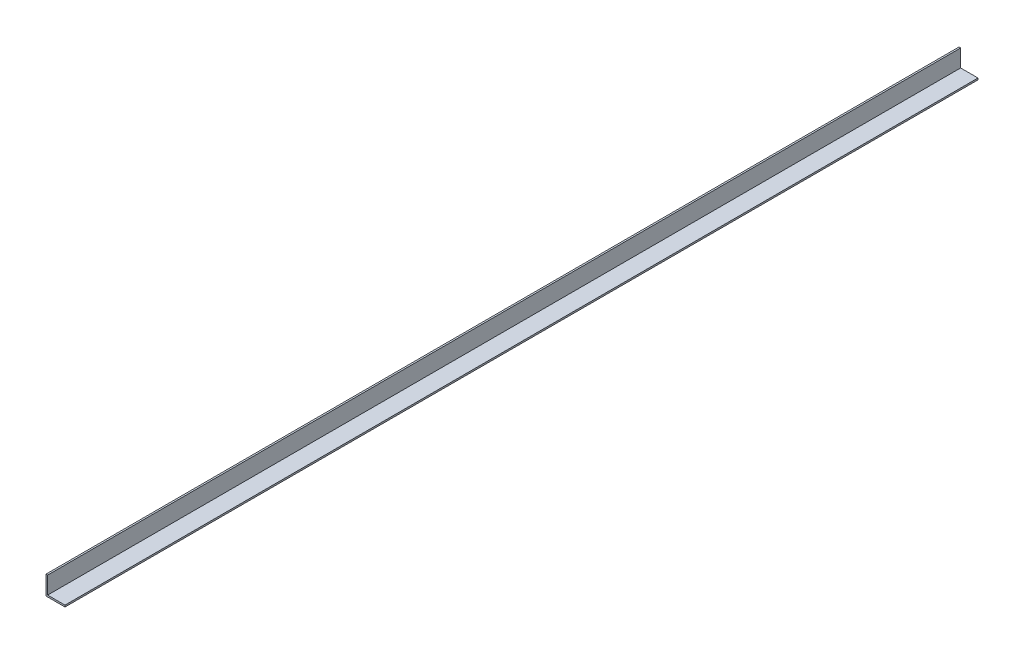
ISO-10303-21;
HEADER;
FILE_DESCRIPTION(('STEP AP214'),'2;1');
FILE_NAME('part.step','',(''),(''),'','','');
FILE_SCHEMA(('AUTOMOTIVE_DESIGN { 1 0 10303 214 1 1 1 1 }'));
ENDSEC;
DATA;
#1=APPLICATION_CONTEXT('core data for automotive mechanical design processes');
#2=APPLICATION_PROTOCOL_DEFINITION('international standard','automotive_design',2000,#1);
#3=PRODUCT_CONTEXT('',#1,'mechanical');
#4=PRODUCT('Part','Part','',(#3));
#5=PRODUCT_RELATED_PRODUCT_CATEGORY('part','',(#4));
#6=PRODUCT_DEFINITION_FORMATION('','',#4);
#7=PRODUCT_DEFINITION_CONTEXT('part definition',#1,'design');
#8=PRODUCT_DEFINITION('design','',#6,#7);
#9=PRODUCT_DEFINITION_SHAPE('','',#8);
#10=(LENGTH_UNIT() NAMED_UNIT(*) SI_UNIT(.MILLI.,.METRE.));
#11=(NAMED_UNIT(*) PLANE_ANGLE_UNIT() SI_UNIT($,.RADIAN.));
#12=(NAMED_UNIT(*) SI_UNIT($,.STERADIAN.) SOLID_ANGLE_UNIT());
#13=UNCERTAINTY_MEASURE_WITH_UNIT(LENGTH_MEASURE(1.E-05),#10,'distance_accuracy_value','');
#14=(GEOMETRIC_REPRESENTATION_CONTEXT(3) GLOBAL_UNCERTAINTY_ASSIGNED_CONTEXT((#13)) GLOBAL_UNIT_ASSIGNED_CONTEXT((#10,
#11,#12)) REPRESENTATION_CONTEXT('',''));
#15=CARTESIAN_POINT('',(0.,0.,0.));
#16=DIRECTION('',(0.,0.,1.));
#17=DIRECTION('',(1.,0.,0.));
#18=AXIS2_PLACEMENT_3D('',#15,#16,#17);
#19=CARTESIAN_POINT('',(11.1,127.,-6100.));
#20=DIRECTION('',(0.,1.,0.));
#21=DIRECTION('',(0.,0.,1.));
#22=AXIS2_PLACEMENT_3D('',#19,#20,#21);
#23=PLANE('',#22);
#24=DIRECTION('',(-1.,0.,0.));
#25=VECTOR('',#24,1.);
#26=CARTESIAN_POINT('',(11.1,127.,0.));
#27=LINE('',#26,#25);
#28=CARTESIAN_POINT('',(11.1,127.,0.));
#29=VERTEX_POINT('',#28);
#30=CARTESIAN_POINT('',(0.,127.,0.));
#31=VERTEX_POINT('',#30);
#32=EDGE_CURVE('E118',#29,#31,#27,.T.);
#33=ORIENTED_EDGE('',*,*,#32,.F.);
#34=DIRECTION('',(0.,0.,1.));
#35=VECTOR('',#34,1.);
#36=CARTESIAN_POINT('',(11.1,127.,-6100.));
#37=LINE('',#36,#35);
#38=CARTESIAN_POINT('',(11.1,127.,-6100.));
#39=VERTEX_POINT('',#38);
#40=EDGE_CURVE('E11',#39,#29,#37,.T.);
#41=ORIENTED_EDGE('',*,*,#40,.F.);
#42=DIRECTION('',(-1.,0.,0.));
#43=VECTOR('',#42,1.);
#44=CARTESIAN_POINT('',(11.1,127.,-6100.));
#45=LINE('',#44,#43);
#46=CARTESIAN_POINT('',(0.,127.,-6100.));
#47=VERTEX_POINT('',#46);
#48=EDGE_CURVE('E132',#39,#47,#45,.T.);
#49=ORIENTED_EDGE('',*,*,#48,.T.);
#50=DIRECTION('',(0.,0.,1.));
#51=VECTOR('',#50,1.);
#52=CARTESIAN_POINT('',(0.,127.,-6100.));
#53=LINE('',#52,#51);
#54=EDGE_CURVE('E36',#47,#31,#53,.T.);
#55=ORIENTED_EDGE('',*,*,#54,.T.);
#56=EDGE_LOOP('',(#33,#41,#49,#55));
#57=FACE_BOUND('',#56,.T.);
#58=ADVANCED_FACE('F33',(#57),#23,.T.);
#59=CARTESIAN_POINT('',(11.1,11.1,-6100.));
#60=DIRECTION('',(1.,0.,0.));
#61=DIRECTION('',(0.,1.,0.));
#62=AXIS2_PLACEMENT_3D('',#59,#60,#61);
#63=PLANE('',#62);
#64=DIRECTION('',(0.,1.,0.));
#65=VECTOR('',#64,1.);
#66=CARTESIAN_POINT('',(11.1,11.1,0.));
#67=LINE('',#66,#65);
#68=CARTESIAN_POINT('',(11.1,11.1,0.));
#69=VERTEX_POINT('',#68);
#70=EDGE_CURVE('E130',#69,#29,#67,.T.);
#71=ORIENTED_EDGE('',*,*,#70,.F.);
#72=DIRECTION('',(0.,0.,1.));
#73=VECTOR('',#72,1.);
#74=CARTESIAN_POINT('',(11.1,11.1,-6100.));
#75=LINE('',#74,#73);
#76=CARTESIAN_POINT('',(11.1,11.1,-6100.));
#77=VERTEX_POINT('',#76);
#78=EDGE_CURVE('E42',#77,#69,#75,.T.);
#79=ORIENTED_EDGE('',*,*,#78,.F.);
#80=DIRECTION('',(0.,1.,0.));
#81=VECTOR('',#80,1.);
#82=CARTESIAN_POINT('',(11.1,11.1,-6100.));
#83=LINE('',#82,#81);
#84=EDGE_CURVE('E108',#77,#39,#83,.T.);
#85=ORIENTED_EDGE('',*,*,#84,.T.);
#86=ORIENTED_EDGE('',*,*,#40,.T.);
#87=EDGE_LOOP('',(#71,#79,#85,#86));
#88=FACE_BOUND('',#87,.T.);
#89=ADVANCED_FACE('F140',(#88),#63,.T.);
#90=CARTESIAN_POINT('',(127.,11.1,-6100.));
#91=DIRECTION('',(0.,1.,0.));
#92=DIRECTION('',(-1.,0.,0.));
#93=AXIS2_PLACEMENT_3D('',#90,#91,#92);
#94=PLANE('',#93);
#95=DIRECTION('',(-1.,0.,0.));
#96=VECTOR('',#95,1.);
#97=CARTESIAN_POINT('',(127.,11.1,0.));
#98=LINE('',#97,#96);
#99=CARTESIAN_POINT('',(127.,11.1,0.));
#100=VERTEX_POINT('',#99);
#101=EDGE_CURVE('E95',#100,#69,#98,.T.);
#102=ORIENTED_EDGE('',*,*,#101,.F.);
#103=DIRECTION('',(0.,0.,1.));
#104=VECTOR('',#103,1.);
#105=CARTESIAN_POINT('',(127.,11.1,-6100.));
#106=LINE('',#105,#104);
#107=CARTESIAN_POINT('',(127.,11.1,-6100.));
#108=VERTEX_POINT('',#107);
#109=EDGE_CURVE('E90',#108,#100,#106,.T.);
#110=ORIENTED_EDGE('',*,*,#109,.F.);
#111=DIRECTION('',(-1.,0.,0.));
#112=VECTOR('',#111,1.);
#113=CARTESIAN_POINT('',(127.,11.1,-6100.));
#114=LINE('',#113,#112);
#115=EDGE_CURVE('E93',#108,#77,#114,.T.);
#116=ORIENTED_EDGE('',*,*,#115,.T.);
#117=ORIENTED_EDGE('',*,*,#78,.T.);
#118=EDGE_LOOP('',(#102,#110,#116,#117));
#119=FACE_BOUND('',#118,.T.);
#120=ADVANCED_FACE('F92',(#119),#94,.T.);
#121=CARTESIAN_POINT('',(127.,0.,-6100.));
#122=DIRECTION('',(1.,0.,0.));
#123=DIRECTION('',(0.,0.,-1.));
#124=AXIS2_PLACEMENT_3D('',#121,#122,#123);
#125=PLANE('',#124);
#126=DIRECTION('',(0.,1.,0.));
#127=VECTOR('',#126,1.);
#128=CARTESIAN_POINT('',(127.,0.,0.));
#129=LINE('',#128,#127);
#130=CARTESIAN_POINT('',(127.,0.,0.));
#131=VERTEX_POINT('',#130);
#132=EDGE_CURVE('E127',#131,#100,#129,.T.);
#133=ORIENTED_EDGE('',*,*,#132,.F.);
#134=DIRECTION('',(0.,0.,1.));
#135=VECTOR('',#134,1.);
#136=CARTESIAN_POINT('',(127.,0.,-6100.));
#137=LINE('',#136,#135);
#138=CARTESIAN_POINT('',(127.,0.,-6100.));
#139=VERTEX_POINT('',#138);
#140=EDGE_CURVE('E100',#139,#131,#137,.T.);
#141=ORIENTED_EDGE('',*,*,#140,.F.);
#142=DIRECTION('',(0.,1.,0.));
#143=VECTOR('',#142,1.);
#144=CARTESIAN_POINT('',(127.,0.,-6100.));
#145=LINE('',#144,#143);
#146=EDGE_CURVE('E106',#139,#108,#145,.T.);
#147=ORIENTED_EDGE('',*,*,#146,.T.);
#148=ORIENTED_EDGE('',*,*,#109,.T.);
#149=EDGE_LOOP('',(#133,#141,#147,#148));
#150=FACE_BOUND('',#149,.T.);
#151=ADVANCED_FACE('F110',(#150),#125,.T.);
#152=CARTESIAN_POINT('',(0.,0.,-6100.));
#153=DIRECTION('',(0.,-1.,0.));
#154=DIRECTION('',(0.,0.,-1.));
#155=AXIS2_PLACEMENT_3D('',#152,#153,#154);
#156=PLANE('',#155);
#157=DIRECTION('',(1.,0.,0.));
#158=VECTOR('',#157,1.);
#159=CARTESIAN_POINT('',(0.,0.,0.));
#160=LINE('',#159,#158);
#161=CARTESIAN_POINT('',(0.,0.,0.));
#162=VERTEX_POINT('',#161);
#163=EDGE_CURVE('E124',#162,#131,#160,.T.);
#164=ORIENTED_EDGE('',*,*,#163,.F.);
#165=DIRECTION('',(0.,0.,1.));
#166=VECTOR('',#165,1.);
#167=CARTESIAN_POINT('',(0.,0.,-6100.));
#168=LINE('',#167,#166);
#169=CARTESIAN_POINT('',(0.,0.,-6100.));
#170=VERTEX_POINT('',#169);
#171=EDGE_CURVE('E135',#170,#162,#168,.T.);
#172=ORIENTED_EDGE('',*,*,#171,.F.);
#173=DIRECTION('',(1.,0.,0.));
#174=VECTOR('',#173,1.);
#175=CARTESIAN_POINT('',(0.,0.,-6100.));
#176=LINE('',#175,#174);
#177=EDGE_CURVE('E111',#170,#139,#176,.T.);
#178=ORIENTED_EDGE('',*,*,#177,.T.);
#179=ORIENTED_EDGE('',*,*,#140,.T.);
#180=EDGE_LOOP('',(#164,#172,#178,#179));
#181=FACE_BOUND('',#180,.T.);
#182=ADVANCED_FACE('F153',(#181),#156,.T.);
#183=CARTESIAN_POINT('',(0.,127.,-6100.));
#184=DIRECTION('',(-1.,0.,0.));
#185=DIRECTION('',(0.,-1.,0.));
#186=AXIS2_PLACEMENT_3D('',#183,#184,#185);
#187=PLANE('',#186);
#188=DIRECTION('',(0.,-1.,0.));
#189=VECTOR('',#188,1.);
#190=CARTESIAN_POINT('',(0.,127.,0.));
#191=LINE('',#190,#189);
#192=EDGE_CURVE('E121',#31,#162,#191,.T.);
#193=ORIENTED_EDGE('',*,*,#192,.F.);
#194=ORIENTED_EDGE('',*,*,#54,.F.);
#195=DIRECTION('',(0.,-1.,0.));
#196=VECTOR('',#195,1.);
#197=CARTESIAN_POINT('',(0.,127.,-6100.));
#198=LINE('',#197,#196);
#199=EDGE_CURVE('E113',#47,#170,#198,.T.);
#200=ORIENTED_EDGE('',*,*,#199,.T.);
#201=ORIENTED_EDGE('',*,*,#171,.T.);
#202=EDGE_LOOP('',(#193,#194,#200,#201));
#203=FACE_BOUND('',#202,.T.);
#204=ADVANCED_FACE('F137',(#203),#187,.T.);
#205=CARTESIAN_POINT('',(0.,0.,-6100.));
#206=DIRECTION('',(0.,0.,1.));
#207=DIRECTION('',(1.,0.,0.));
#208=AXIS2_PLACEMENT_3D('',#205,#206,#207);
#209=PLANE('',#208);
#210=ORIENTED_EDGE('',*,*,#48,.F.);
#211=ORIENTED_EDGE('',*,*,#84,.F.);
#212=ORIENTED_EDGE('',*,*,#115,.F.);
#213=ORIENTED_EDGE('',*,*,#146,.F.);
#214=ORIENTED_EDGE('',*,*,#177,.F.);
#215=ORIENTED_EDGE('',*,*,#199,.F.);
#216=EDGE_LOOP('',(#210,#211,#212,#213,#214,#215));
#217=FACE_BOUND('',#216,.T.);
#218=ADVANCED_FACE('F104',(#217),#209,.F.);
#219=CARTESIAN_POINT('',(0.,0.,0.));
#220=DIRECTION('',(0.,0.,1.));
#221=DIRECTION('',(1.,0.,0.));
#222=AXIS2_PLACEMENT_3D('',#219,#220,#221);
#223=PLANE('',#222);
#224=ORIENTED_EDGE('',*,*,#32,.T.);
#225=ORIENTED_EDGE('',*,*,#192,.T.);
#226=ORIENTED_EDGE('',*,*,#163,.T.);
#227=ORIENTED_EDGE('',*,*,#132,.T.);
#228=ORIENTED_EDGE('',*,*,#101,.T.);
#229=ORIENTED_EDGE('',*,*,#70,.T.);
#230=EDGE_LOOP('',(#224,#225,#226,#227,#228,#229));
#231=FACE_BOUND('',#230,.T.);
#232=ADVANCED_FACE('F139',(#231),#223,.T.);
#233=CLOSED_SHELL('',(#58,#89,#120,#151,#182,#204,#218,#232));
#234=MANIFOLD_SOLID_BREP('B2',#233);
#235=ADVANCED_BREP_SHAPE_REPRESENTATION('',(#18,#234),#14);
#236=SHAPE_DEFINITION_REPRESENTATION(#9,#235);
ENDSEC;
END-ISO-10303-21;
